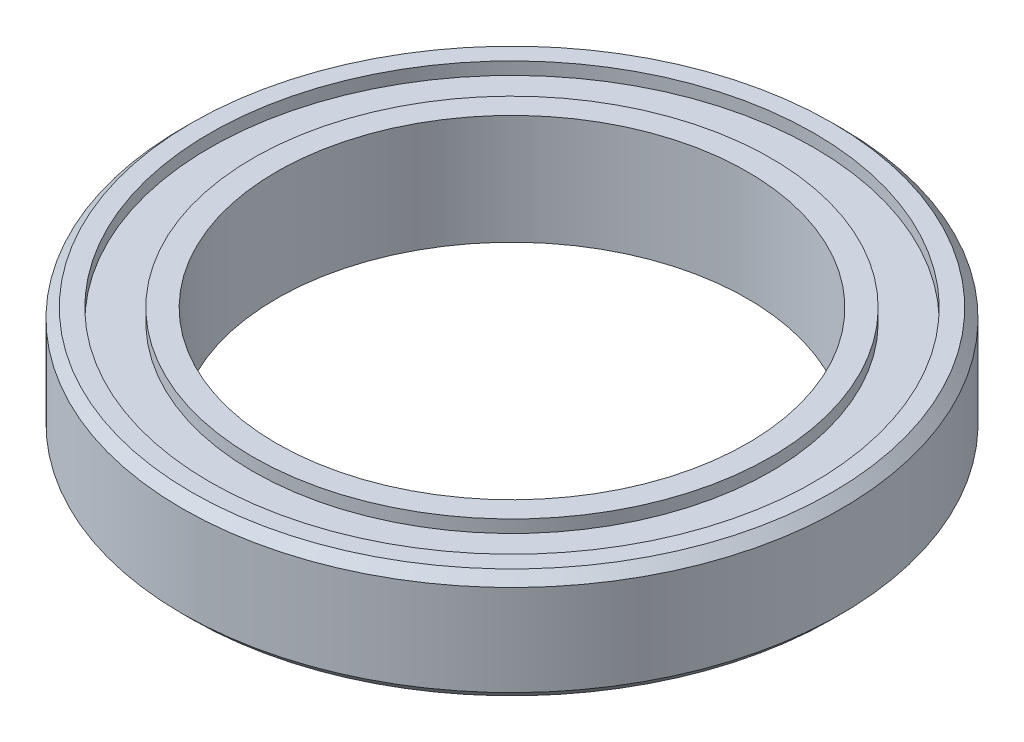
ISO-10303-21;
HEADER;
FILE_DESCRIPTION(('STEP AP214'),'2;1');
FILE_NAME('part.step','',(''),(''),'','','');
FILE_SCHEMA(('AUTOMOTIVE_DESIGN { 1 0 10303 214 1 1 1 1 }'));
ENDSEC;
DATA;
#1=APPLICATION_CONTEXT('core data for automotive mechanical design processes');
#2=APPLICATION_PROTOCOL_DEFINITION('international standard','automotive_design',2000,#1);
#3=PRODUCT_CONTEXT('',#1,'mechanical');
#4=PRODUCT('Part','Part','',(#3));
#5=PRODUCT_RELATED_PRODUCT_CATEGORY('part','',(#4));
#6=PRODUCT_DEFINITION_FORMATION('','',#4);
#7=PRODUCT_DEFINITION_CONTEXT('part definition',#1,'design');
#8=PRODUCT_DEFINITION('design','',#6,#7);
#9=PRODUCT_DEFINITION_SHAPE('','',#8);
#10=(LENGTH_UNIT() NAMED_UNIT(*) SI_UNIT(.MILLI.,.METRE.));
#11=(NAMED_UNIT(*) PLANE_ANGLE_UNIT() SI_UNIT($,.RADIAN.));
#12=(NAMED_UNIT(*) SI_UNIT($,.STERADIAN.) SOLID_ANGLE_UNIT());
#13=UNCERTAINTY_MEASURE_WITH_UNIT(LENGTH_MEASURE(1.E-05),#10,'distance_accuracy_value','');
#14=(GEOMETRIC_REPRESENTATION_CONTEXT(3) GLOBAL_UNCERTAINTY_ASSIGNED_CONTEXT((#13)) GLOBAL_UNIT_ASSIGNED_CONTEXT((#10,
#11,#12)) REPRESENTATION_CONTEXT('',''));
#15=CARTESIAN_POINT('',(0.,0.,0.));
#16=DIRECTION('',(0.,0.,1.));
#17=DIRECTION('',(1.,0.,0.));
#18=AXIS2_PLACEMENT_3D('',#15,#16,#17);
#19=CARTESIAN_POINT('',(0.,0.,0.));
#20=DIRECTION('',(0.,1.,0.));
#21=DIRECTION('',(0.,0.,1.));
#22=AXIS2_PLACEMENT_3D('',#19,#20,#21);
#23=PLANE('',#22);
#24=CARTESIAN_POINT('',(0.,0.,0.));
#25=DIRECTION('',(0.,1.,0.));
#26=DIRECTION('',(0.,0.,1.));
#27=AXIS2_PLACEMENT_3D('',#24,#25,#26);
#28=CIRCLE('',#27,15.);
#29=CARTESIAN_POINT('',(0.,0.,15.));
#30=VERTEX_POINT('',#29);
#31=EDGE_CURVE('E57',#30,#30,#28,.T.);
#32=ORIENTED_EDGE('',*,*,#31,.T.);
#33=EDGE_LOOP('',(#32));
#34=FACE_BOUND('',#33,.T.);
#35=CARTESIAN_POINT('',(0.,0.,0.));
#36=DIRECTION('',(0.,-1.,0.));
#37=DIRECTION('',(0.,0.,-1.));
#38=AXIS2_PLACEMENT_3D('',#35,#36,#37);
#39=CIRCLE('',#38,16.5);
#40=CARTESIAN_POINT('',(0.,0.,-16.5));
#41=VERTEX_POINT('',#40);
#42=EDGE_CURVE('E81',#41,#41,#39,.T.);
#43=ORIENTED_EDGE('',*,*,#42,.T.);
#44=EDGE_LOOP('',(#43));
#45=FACE_BOUND('',#44,.T.);
#46=ADVANCED_FACE('F36',(#34,#45),#23,.F.);
#47=CARTESIAN_POINT('',(0.,7.,0.));
#48=DIRECTION('',(0.,1.,0.));
#49=DIRECTION('',(0.,0.,1.));
#50=AXIS2_PLACEMENT_3D('',#47,#48,#49);
#51=PLANE('',#50);
#52=CARTESIAN_POINT('',(0.,7.,0.));
#53=DIRECTION('',(0.,1.,0.));
#54=DIRECTION('',(0.,0.,1.));
#55=AXIS2_PLACEMENT_3D('',#52,#53,#54);
#56=CIRCLE('',#55,15.);
#57=CARTESIAN_POINT('',(0.,7.,15.));
#58=VERTEX_POINT('',#57);
#59=EDGE_CURVE('E56',#58,#58,#56,.T.);
#60=ORIENTED_EDGE('',*,*,#59,.F.);
#61=EDGE_LOOP('',(#60));
#62=FACE_BOUND('',#61,.T.);
#63=CARTESIAN_POINT('',(0.,7.,0.));
#64=DIRECTION('',(0.,1.,0.));
#65=DIRECTION('',(0.,0.,1.));
#66=AXIS2_PLACEMENT_3D('',#63,#64,#65);
#67=CIRCLE('',#66,16.5);
#68=CARTESIAN_POINT('',(0.,7.,16.5));
#69=VERTEX_POINT('',#68);
#70=EDGE_CURVE('E69',#69,#69,#67,.T.);
#71=ORIENTED_EDGE('',*,*,#70,.T.);
#72=EDGE_LOOP('',(#71));
#73=FACE_BOUND('',#72,.T.);
#74=ADVANCED_FACE('F115',(#62,#73),#51,.T.);
#75=CARTESIAN_POINT('',(0.,7.,0.));
#76=DIRECTION('',(0.,1.,0.));
#77=DIRECTION('',(0.,0.,1.));
#78=AXIS2_PLACEMENT_3D('',#75,#76,#77);
#79=CIRCLE('',#78,19.25);
#80=CARTESIAN_POINT('',(0.,7.,19.25));
#81=VERTEX_POINT('',#80);
#82=EDGE_CURVE('E63',#81,#81,#79,.T.);
#83=ORIENTED_EDGE('',*,*,#82,.F.);
#84=EDGE_LOOP('',(#83));
#85=FACE_BOUND('',#84,.T.);
#86=CARTESIAN_POINT('',(0.,7.,0.));
#87=DIRECTION('',(0.,1.,0.));
#88=DIRECTION('',(0.,0.,1.));
#89=AXIS2_PLACEMENT_3D('',#86,#87,#88);
#90=CIRCLE('',#89,20.4);
#91=CARTESIAN_POINT('',(0.,7.,20.4));
#92=VERTEX_POINT('',#91);
#93=EDGE_CURVE('E10',#92,#92,#90,.T.);
#94=ORIENTED_EDGE('',*,*,#93,.T.);
#95=EDGE_LOOP('',(#94));
#96=FACE_BOUND('',#95,.T.);
#97=ADVANCED_FACE('F106',(#85,#96),#51,.T.);
#98=CARTESIAN_POINT('',(0.,0.,0.));
#99=DIRECTION('',(0.,-1.,0.));
#100=DIRECTION('',(0.,0.,-1.));
#101=AXIS2_PLACEMENT_3D('',#98,#99,#100);
#102=CIRCLE('',#101,19.25);
#103=CARTESIAN_POINT('',(0.,0.,-19.25));
#104=VERTEX_POINT('',#103);
#105=EDGE_CURVE('E75',#104,#104,#102,.T.);
#106=ORIENTED_EDGE('',*,*,#105,.F.);
#107=EDGE_LOOP('',(#106));
#108=FACE_BOUND('',#107,.T.);
#109=CARTESIAN_POINT('',(0.,0.,0.));
#110=DIRECTION('',(0.,1.,0.));
#111=DIRECTION('',(0.,0.,1.));
#112=AXIS2_PLACEMENT_3D('',#109,#110,#111);
#113=CIRCLE('',#112,20.4);
#114=CARTESIAN_POINT('',(0.,0.,20.4));
#115=VERTEX_POINT('',#114);
#116=EDGE_CURVE('E43',#115,#115,#113,.F.);
#117=ORIENTED_EDGE('',*,*,#116,.T.);
#118=EDGE_LOOP('',(#117));
#119=FACE_BOUND('',#118,.T.);
#120=ADVANCED_FACE('F103',(#108,#119),#23,.F.);
#121=CARTESIAN_POINT('',(0.,7.,0.));
#122=DIRECTION('',(0.,-1.,0.));
#123=DIRECTION('',(0.,0.,-1.));
#124=AXIS2_PLACEMENT_3D('',#121,#122,#123);
#125=CYLINDRICAL_SURFACE('',#124,21.);
#126=CARTESIAN_POINT('',(0.,0.599999999999996,0.));
#127=DIRECTION('',(0.,1.,0.));
#128=DIRECTION('',(0.,0.,1.));
#129=AXIS2_PLACEMENT_3D('',#126,#127,#128);
#130=CIRCLE('',#129,21.);
#131=CARTESIAN_POINT('',(0.,0.599999999999996,21.));
#132=VERTEX_POINT('',#131);
#133=EDGE_CURVE('E47',#132,#132,#130,.T.);
#134=ORIENTED_EDGE('',*,*,#133,.T.);
#135=EDGE_LOOP('',(#134));
#136=FACE_BOUND('',#135,.T.);
#137=CARTESIAN_POINT('',(0.,6.4,0.));
#138=DIRECTION('',(0.,1.,0.));
#139=DIRECTION('',(0.,0.,1.));
#140=AXIS2_PLACEMENT_3D('',#137,#138,#139);
#141=CIRCLE('',#140,21.);
#142=CARTESIAN_POINT('',(0.,6.4,21.));
#143=VERTEX_POINT('',#142);
#144=EDGE_CURVE('E51',#143,#143,#141,.F.);
#145=ORIENTED_EDGE('',*,*,#144,.T.);
#146=EDGE_LOOP('',(#145));
#147=FACE_BOUND('',#146,.T.);
#148=ADVANCED_FACE('F105',(#136,#147),#125,.T.);
#149=CARTESIAN_POINT('',(0.,7.,0.));
#150=DIRECTION('',(0.,-1.,0.));
#151=DIRECTION('',(0.,0.,-1.));
#152=AXIS2_PLACEMENT_3D('',#149,#150,#151);
#153=CYLINDRICAL_SURFACE('',#152,15.);
#154=ORIENTED_EDGE('',*,*,#59,.T.);
#155=EDGE_LOOP('',(#154));
#156=FACE_BOUND('',#155,.T.);
#157=ORIENTED_EDGE('',*,*,#31,.F.);
#158=EDGE_LOOP('',(#157));
#159=FACE_BOUND('',#158,.T.);
#160=ADVANCED_FACE('F112',(#156,#159),#153,.F.);
#161=CARTESIAN_POINT('',(0.,0.599999999999996,0.));
#162=DIRECTION('',(0.,1.,0.));
#163=DIRECTION('',(0.,0.,1.));
#164=AXIS2_PLACEMENT_3D('',#161,#162,#163);
#165=CONICAL_SURFACE('',#164,21.,0.785398163397451);
#166=ORIENTED_EDGE('',*,*,#116,.F.);
#167=EDGE_LOOP('',(#166));
#168=FACE_BOUND('',#167,.T.);
#169=ORIENTED_EDGE('',*,*,#133,.F.);
#170=EDGE_LOOP('',(#169));
#171=FACE_BOUND('',#170,.T.);
#172=ADVANCED_FACE('F144',(#168,#171),#165,.T.);
#173=CARTESIAN_POINT('',(0.,7.,0.));
#174=DIRECTION('',(0.,-1.,0.));
#175=DIRECTION('',(0.,0.,-1.));
#176=AXIS2_PLACEMENT_3D('',#173,#174,#175);
#177=CONICAL_SURFACE('',#176,20.4,0.78539816339744);
#178=ORIENTED_EDGE('',*,*,#144,.F.);
#179=EDGE_LOOP('',(#178));
#180=FACE_BOUND('',#179,.T.);
#181=ORIENTED_EDGE('',*,*,#93,.F.);
#182=EDGE_LOOP('',(#181));
#183=FACE_BOUND('',#182,.T.);
#184=ADVANCED_FACE('F38',(#180,#183),#177,.T.);
#185=CARTESIAN_POINT('',(0.,6.2,0.));
#186=DIRECTION('',(0.,1.,0.));
#187=DIRECTION('',(0.,0.,1.));
#188=AXIS2_PLACEMENT_3D('',#185,#186,#187);
#189=CYLINDRICAL_SURFACE('',#188,19.25);
#190=CARTESIAN_POINT('',(0.,6.2,0.));
#191=DIRECTION('',(0.,1.,0.));
#192=DIRECTION('',(0.,0.,1.));
#193=AXIS2_PLACEMENT_3D('',#190,#191,#192);
#194=CIRCLE('',#193,19.25);
#195=CARTESIAN_POINT('',(0.,6.2,19.25));
#196=VERTEX_POINT('',#195);
#197=EDGE_CURVE('E60',#196,#196,#194,.T.);
#198=ORIENTED_EDGE('',*,*,#197,.F.);
#199=EDGE_LOOP('',(#198));
#200=FACE_BOUND('',#199,.T.);
#201=ORIENTED_EDGE('',*,*,#82,.T.);
#202=EDGE_LOOP('',(#201));
#203=FACE_BOUND('',#202,.T.);
#204=ADVANCED_FACE('F138',(#200,#203),#189,.F.);
#205=CARTESIAN_POINT('',(0.,6.2,0.));
#206=DIRECTION('',(0.,1.,0.));
#207=DIRECTION('',(0.,0.,1.));
#208=AXIS2_PLACEMENT_3D('',#205,#206,#207);
#209=PLANE('',#208);
#210=CARTESIAN_POINT('',(0.,6.2,0.));
#211=DIRECTION('',(0.,1.,0.));
#212=DIRECTION('',(0.,0.,1.));
#213=AXIS2_PLACEMENT_3D('',#210,#211,#212);
#214=CIRCLE('',#213,16.5);
#215=CARTESIAN_POINT('',(0.,6.2,16.5));
#216=VERTEX_POINT('',#215);
#217=EDGE_CURVE('E66',#216,#216,#214,.T.);
#218=ORIENTED_EDGE('',*,*,#217,.F.);
#219=EDGE_LOOP('',(#218));
#220=FACE_BOUND('',#219,.T.);
#221=ORIENTED_EDGE('',*,*,#197,.T.);
#222=EDGE_LOOP('',(#221));
#223=FACE_BOUND('',#222,.T.);
#224=ADVANCED_FACE('F134',(#220,#223),#209,.T.);
#225=CARTESIAN_POINT('',(0.,6.2,0.));
#226=DIRECTION('',(0.,1.,0.));
#227=DIRECTION('',(0.,0.,1.));
#228=AXIS2_PLACEMENT_3D('',#225,#226,#227);
#229=CYLINDRICAL_SURFACE('',#228,16.5);
#230=ORIENTED_EDGE('',*,*,#217,.T.);
#231=EDGE_LOOP('',(#230));
#232=FACE_BOUND('',#231,.T.);
#233=ORIENTED_EDGE('',*,*,#70,.F.);
#234=EDGE_LOOP('',(#233));
#235=FACE_BOUND('',#234,.T.);
#236=ADVANCED_FACE('F99',(#232,#235),#229,.T.);
#237=CARTESIAN_POINT('',(0.,0.8,0.));
#238=DIRECTION('',(0.,-1.,0.));
#239=DIRECTION('',(0.,0.,-1.));
#240=AXIS2_PLACEMENT_3D('',#237,#238,#239);
#241=CYLINDRICAL_SURFACE('',#240,19.25);
#242=CARTESIAN_POINT('',(0.,0.8,0.));
#243=DIRECTION('',(0.,-1.,0.));
#244=DIRECTION('',(0.,0.,-1.));
#245=AXIS2_PLACEMENT_3D('',#242,#243,#244);
#246=CIRCLE('',#245,19.25);
#247=CARTESIAN_POINT('',(0.,0.8,-19.25));
#248=VERTEX_POINT('',#247);
#249=EDGE_CURVE('E72',#248,#248,#246,.T.);
#250=ORIENTED_EDGE('',*,*,#249,.F.);
#251=EDGE_LOOP('',(#250));
#252=FACE_BOUND('',#251,.T.);
#253=ORIENTED_EDGE('',*,*,#105,.T.);
#254=EDGE_LOOP('',(#253));
#255=FACE_BOUND('',#254,.T.);
#256=ADVANCED_FACE('F93',(#252,#255),#241,.F.);
#257=CARTESIAN_POINT('',(0.,0.8,0.));
#258=DIRECTION('',(0.,-1.,0.));
#259=DIRECTION('',(0.,0.,-1.));
#260=AXIS2_PLACEMENT_3D('',#257,#258,#259);
#261=PLANE('',#260);
#262=CARTESIAN_POINT('',(0.,0.8,0.));
#263=DIRECTION('',(0.,-1.,0.));
#264=DIRECTION('',(0.,0.,-1.));
#265=AXIS2_PLACEMENT_3D('',#262,#263,#264);
#266=CIRCLE('',#265,16.5);
#267=CARTESIAN_POINT('',(0.,0.8,-16.5));
#268=VERTEX_POINT('',#267);
#269=EDGE_CURVE('E78',#268,#268,#266,.T.);
#270=ORIENTED_EDGE('',*,*,#269,.F.);
#271=EDGE_LOOP('',(#270));
#272=FACE_BOUND('',#271,.T.);
#273=ORIENTED_EDGE('',*,*,#249,.T.);
#274=EDGE_LOOP('',(#273));
#275=FACE_BOUND('',#274,.T.);
#276=ADVANCED_FACE('F90',(#272,#275),#261,.T.);
#277=CARTESIAN_POINT('',(0.,0.8,0.));
#278=DIRECTION('',(0.,-1.,0.));
#279=DIRECTION('',(0.,0.,-1.));
#280=AXIS2_PLACEMENT_3D('',#277,#278,#279);
#281=CYLINDRICAL_SURFACE('',#280,16.5);
#282=ORIENTED_EDGE('',*,*,#269,.T.);
#283=EDGE_LOOP('',(#282));
#284=FACE_BOUND('',#283,.T.);
#285=ORIENTED_EDGE('',*,*,#42,.F.);
#286=EDGE_LOOP('',(#285));
#287=FACE_BOUND('',#286,.T.);
#288=ADVANCED_FACE('F87',(#284,#287),#281,.T.);
#289=CLOSED_SHELL('',(#46,#74,#97,#120,#148,#160,#172,#184,#204,#224,#236,#256,#276,#288));
#290=MANIFOLD_SOLID_BREP('B2',#289);
#291=ADVANCED_BREP_SHAPE_REPRESENTATION('',(#18,#290),#14);
#292=SHAPE_DEFINITION_REPRESENTATION(#9,#291);
ENDSEC;
END-ISO-10303-21;
